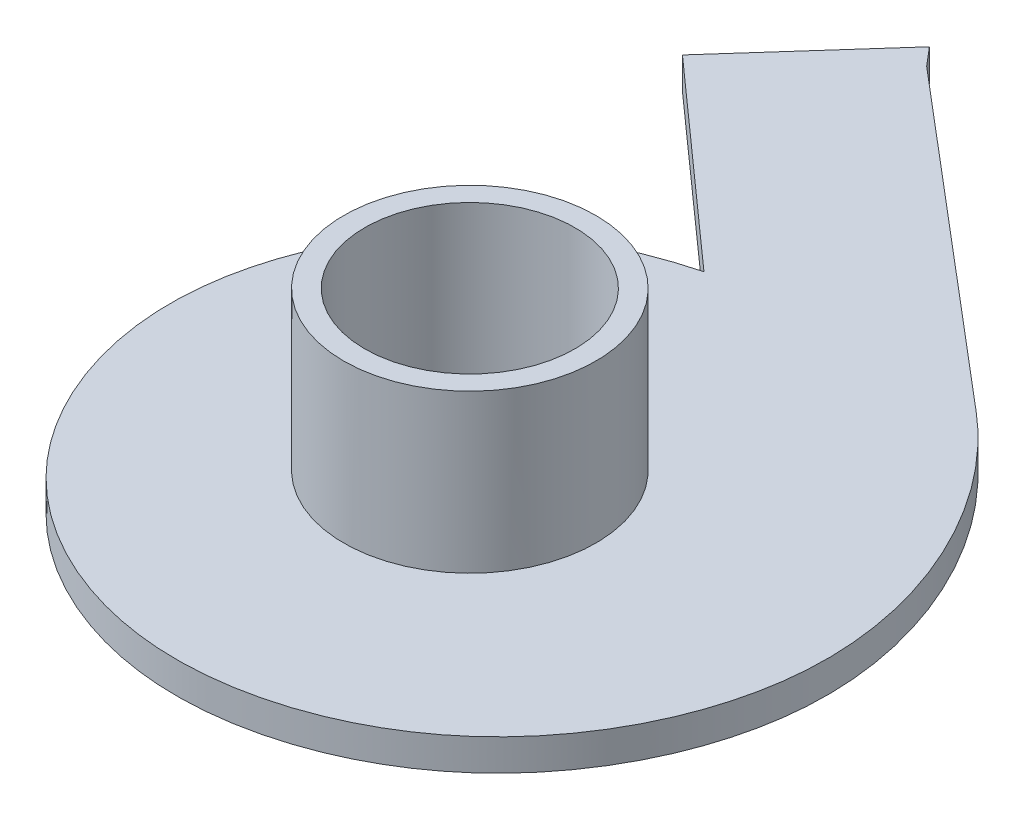
ISO-10303-21;
HEADER;
FILE_DESCRIPTION(('STEP AP214'),'2;1');
FILE_NAME('part.step','',(''),(''),'','','');
FILE_SCHEMA(('AUTOMOTIVE_DESIGN { 1 0 10303 214 1 1 1 1 }'));
ENDSEC;
DATA;
#1=APPLICATION_CONTEXT('core data for automotive mechanical design processes');
#2=APPLICATION_PROTOCOL_DEFINITION('international standard','automotive_design',2000,#1);
#3=PRODUCT_CONTEXT('',#1,'mechanical');
#4=PRODUCT('Part','Part','',(#3));
#5=PRODUCT_RELATED_PRODUCT_CATEGORY('part','',(#4));
#6=PRODUCT_DEFINITION_FORMATION('','',#4);
#7=PRODUCT_DEFINITION_CONTEXT('part definition',#1,'design');
#8=PRODUCT_DEFINITION('design','',#6,#7);
#9=PRODUCT_DEFINITION_SHAPE('','',#8);
#10=(LENGTH_UNIT() NAMED_UNIT(*) SI_UNIT(.MILLI.,.METRE.));
#11=(NAMED_UNIT(*) PLANE_ANGLE_UNIT() SI_UNIT($,.RADIAN.));
#12=(NAMED_UNIT(*) SI_UNIT($,.STERADIAN.) SOLID_ANGLE_UNIT());
#13=UNCERTAINTY_MEASURE_WITH_UNIT(LENGTH_MEASURE(1.E-05),#10,'distance_accuracy_value','');
#14=(GEOMETRIC_REPRESENTATION_CONTEXT(3) GLOBAL_UNCERTAINTY_ASSIGNED_CONTEXT((#13)) GLOBAL_UNIT_ASSIGNED_CONTEXT((#10,
#11,#12)) REPRESENTATION_CONTEXT('',''));
#15=CARTESIAN_POINT('',(0.,0.,0.));
#16=DIRECTION('',(0.,0.,1.));
#17=DIRECTION('',(1.,0.,0.));
#18=AXIS2_PLACEMENT_3D('',#15,#16,#17);
#19=CARTESIAN_POINT('',(-0.894449402051996,-8.5,29.4356862613004));
#20=DIRECTION('',(0.,-1.,0.));
#21=DIRECTION('',(0.,0.,-1.));
#22=AXIS2_PLACEMENT_3D('',#19,#20,#21);
#23=PLANE('',#22);
#24=CARTESIAN_POINT('',(-5.22427761905528,-8.5,-27.5));
#25=CARTESIAN_POINT('',(-10.5414760287274,-8.5,-26.1055486308366));
#26=CARTESIAN_POINT('',(-22.3528806270504,-8.5,-20.1536533849309));
#27=CARTESIAN_POINT('',(-31.0291674597841,-8.5,0.0898415924964994));
#28=CARTESIAN_POINT('',(-22.1814636965212,-8.5,22.3687512330108));
#29=CARTESIAN_POINT('',(0.169332427189046,-8.5,32.6204579671601));
#30=CARTESIAN_POINT('',(24.4327872859851,-8.5,24.2214208486498));
#31=CARTESIAN_POINT('',(36.1959543019705,-8.5,-0.308919094755898));
#32=CARTESIAN_POINT('',(28.5933574618061,-8.5,-19.700328424709));
#33=CARTESIAN_POINT('',(20.9709982748284,-8.5,-27.4655959659634));
#34=CARTESIAN_POINT('',(19.2682331922488,-8.5,-28.9079718519294));
#35=B_SPLINE_CURVE_WITH_KNOTS('',3,(#24,#25,#26,#27,#28,#29,#30,#31,#32,#33,#34),.UNSPECIFIED.,
.F.,.F.,(4,1,1,1,1,1,1,1,4),(0.0311414600631431,0.128255490419593,0.2545037351108,
0.382472085092047,0.513921580292955,0.651163570803289,0.795187225893968,0.945993586583319,
0.986328935233771),.UNSPECIFIED.);
#36=CARTESIAN_POINT('',(-5.22427761905528,-8.5,-27.5));
#37=VERTEX_POINT('',#36);
#38=CARTESIAN_POINT('',(19.2682331922488,-8.5,-28.9079718519294));
#39=VERTEX_POINT('',#38);
#40=EDGE_CURVE('E110',#37,#39,#35,.T.);
#41=ORIENTED_EDGE('',*,*,#40,.T.);
#42=DIRECTION('',(-0.763038224476822,0.,-0.646353361550212));
#43=VECTOR('',#42,1.);
#44=CARTESIAN_POINT('',(19.2682331922488,-8.5,-28.9079718519294));
#45=LINE('',#44,#43);
#46=CARTESIAN_POINT('',(-11.5525057401742,-8.5,-55.0155606664897));
#47=VERTEX_POINT('',#46);
#48=EDGE_CURVE('E128',#39,#47,#45,.T.);
#49=ORIENTED_EDGE('',*,*,#48,.T.);
#50=DIRECTION('',(-0.648121634012593,0.,-0.761536832677741));
#51=VECTOR('',#50,1.);
#52=CARTESIAN_POINT('',(-13.0354646093329,-8.5,-56.758023409507));
#53=LINE('',#52,#51);
#54=CARTESIAN_POINT('',(-13.0354646093329,-8.5,-56.758023409507));
#55=VERTEX_POINT('',#54);
#56=EDGE_CURVE('E135',#47,#55,#53,.T.);
#57=ORIENTED_EDGE('',*,*,#56,.T.);
#58=DIRECTION('',(-0.665460377003037,0.,0.746433176271645));
#59=VECTOR('',#58,1.);
#60=CARTESIAN_POINT('',(-24.1094731973058,-8.5,-44.3365364359222));
#61=LINE('',#60,#59);
#62=CARTESIAN_POINT('',(-24.1094731973058,-8.5,-44.3365364359222));
#63=VERTEX_POINT('',#62);
#64=EDGE_CURVE('E112',#55,#63,#61,.T.);
#65=ORIENTED_EDGE('',*,*,#64,.T.);
#66=DIRECTION('',(0.746433176271645,0.,0.665460377003037));
#67=VECTOR('',#66,1.);
#68=CARTESIAN_POINT('',(-5.22427761905528,-8.5,-27.5));
#69=LINE('',#68,#67);
#70=EDGE_CURVE('E98',#63,#37,#69,.T.);
#71=ORIENTED_EDGE('',*,*,#70,.T.);
#72=EDGE_LOOP('',(#41,#49,#57,#65,#71));
#73=FACE_BOUND('',#72,.T.);
#74=CARTESIAN_POINT('',(0.,-8.5,0.));
#75=DIRECTION('',(0.,-1.,0.));
#76=DIRECTION('',(0.,0.,-1.));
#77=AXIS2_PLACEMENT_3D('',#74,#75,#76);
#78=CIRCLE('',#77,12.);
#79=CARTESIAN_POINT('',(0.,-8.5,-12.));
#80=VERTEX_POINT('',#79);
#81=EDGE_CURVE('E11',#80,#80,#78,.F.);
#82=ORIENTED_EDGE('',*,*,#81,.F.);
#83=EDGE_LOOP('',(#82));
#84=FACE_BOUND('',#83,.T.);
#85=ADVANCED_FACE('F47',(#73,#84),#23,.F.);
#86=CARTESIAN_POINT('',(-24.1094731973058,-8.5,-44.3365364359222));
#87=DIRECTION('',(0.746433176271645,0.,0.665460377003037));
#88=DIRECTION('',(-0.665460377003037,0.,0.746433176271645));
#89=AXIS2_PLACEMENT_3D('',#86,#87,#88);
#90=PLANE('',#89);
#91=DIRECTION('',(0.,-1.,0.));
#92=VECTOR('',#91,1.);
#93=CARTESIAN_POINT('',(-24.1094731973058,-8.5,-44.3365364359222));
#94=LINE('',#93,#92);
#95=CARTESIAN_POINT('',(-24.1094731973058,-11.5,-44.3365364359222));
#96=VERTEX_POINT('',#95);
#97=EDGE_CURVE('E57',#63,#96,#94,.T.);
#98=ORIENTED_EDGE('',*,*,#97,.F.);
#99=ORIENTED_EDGE('',*,*,#64,.F.);
#100=DIRECTION('',(0.,-1.,0.));
#101=VECTOR('',#100,1.);
#102=CARTESIAN_POINT('',(-13.0354646093329,-8.5,-56.758023409507));
#103=LINE('',#102,#101);
#104=CARTESIAN_POINT('',(-13.0354646093329,-11.5,-56.758023409507));
#105=VERTEX_POINT('',#104);
#106=EDGE_CURVE('E230',#55,#105,#103,.T.);
#107=ORIENTED_EDGE('',*,*,#106,.T.);
#108=DIRECTION('',(-0.665460377003037,0.,0.746433176271645));
#109=VECTOR('',#108,1.);
#110=CARTESIAN_POINT('',(-24.1094731973058,-11.5,-44.3365364359222));
#111=LINE('',#110,#109);
#112=EDGE_CURVE('E216',#105,#96,#111,.T.);
#113=ORIENTED_EDGE('',*,*,#112,.T.);
#114=EDGE_LOOP('',(#98,#99,#107,#113));
#115=FACE_BOUND('',#114,.T.);
#116=ADVANCED_FACE('F158',(#115),#90,.F.);
#117=CARTESIAN_POINT('',(-13.0354646093329,-8.5,-56.758023409507));
#118=DIRECTION('',(-0.761536832677741,0.,0.648121634012593));
#119=DIRECTION('',(-0.648121634012593,0.,-0.761536832677741));
#120=AXIS2_PLACEMENT_3D('',#117,#118,#119);
#121=PLANE('',#120);
#122=ORIENTED_EDGE('',*,*,#106,.F.);
#123=ORIENTED_EDGE('',*,*,#56,.F.);
#124=DIRECTION('',(0.,-1.,0.));
#125=VECTOR('',#124,1.);
#126=CARTESIAN_POINT('',(-11.5525057401742,-8.5,-55.0155606664897));
#127=LINE('',#126,#125);
#128=CARTESIAN_POINT('',(-11.5525057401742,-11.5,-55.0155606664897));
#129=VERTEX_POINT('',#128);
#130=EDGE_CURVE('E232',#47,#129,#127,.T.);
#131=ORIENTED_EDGE('',*,*,#130,.T.);
#132=DIRECTION('',(-0.648121634012593,0.,-0.761536832677741));
#133=VECTOR('',#132,1.);
#134=CARTESIAN_POINT('',(-13.0354646093329,-11.5,-56.758023409507));
#135=LINE('',#134,#133);
#136=EDGE_CURVE('E226',#129,#105,#135,.T.);
#137=ORIENTED_EDGE('',*,*,#136,.T.);
#138=EDGE_LOOP('',(#122,#123,#131,#137));
#139=FACE_BOUND('',#138,.T.);
#140=ADVANCED_FACE('F156',(#139),#121,.F.);
#141=CARTESIAN_POINT('',(19.2682331922488,-8.5,-28.9079718519294));
#142=DIRECTION('',(-0.646353361550212,0.,0.763038224476822));
#143=DIRECTION('',(-0.763038224476822,0.,-0.646353361550212));
#144=AXIS2_PLACEMENT_3D('',#141,#142,#143);
#145=PLANE('',#144);
#146=ORIENTED_EDGE('',*,*,#130,.F.);
#147=ORIENTED_EDGE('',*,*,#48,.F.);
#148=DIRECTION('',(0.,-1.,0.));
#149=VECTOR('',#148,1.);
#150=CARTESIAN_POINT('',(19.2682331922488,-8.5,-28.9079718519294));
#151=LINE('',#150,#149);
#152=CARTESIAN_POINT('',(19.2682331922488,-11.5,-28.9079718519294));
#153=VERTEX_POINT('',#152);
#154=EDGE_CURVE('E65',#39,#153,#151,.T.);
#155=ORIENTED_EDGE('',*,*,#154,.T.);
#156=DIRECTION('',(-0.763038224476822,0.,-0.646353361550212));
#157=VECTOR('',#156,1.);
#158=CARTESIAN_POINT('',(19.2682331922488,-11.5,-28.9079718519294));
#159=LINE('',#158,#157);
#160=EDGE_CURVE('E105',#153,#129,#159,.T.);
#161=ORIENTED_EDGE('',*,*,#160,.T.);
#162=EDGE_LOOP('',(#146,#147,#155,#161));
#163=FACE_BOUND('',#162,.T.);
#164=ADVANCED_FACE('F152',(#163),#145,.F.);
#165=CARTESIAN_POINT('',(-5.22427761905528,-8.5,-27.5));
#166=CARTESIAN_POINT('',(-10.5414760287274,-8.5,-26.1055486308366));
#167=CARTESIAN_POINT('',(-22.3528806270504,-8.5,-20.1536533849309));
#168=CARTESIAN_POINT('',(-31.0291674597841,-8.5,0.0898415924964994));
#169=CARTESIAN_POINT('',(-22.1814636965212,-8.5,22.3687512330108));
#170=CARTESIAN_POINT('',(0.169332427189046,-8.5,32.6204579671601));
#171=CARTESIAN_POINT('',(24.4327872859851,-8.5,24.2214208486498));
#172=CARTESIAN_POINT('',(36.1959543019705,-8.5,-0.308919094755898));
#173=CARTESIAN_POINT('',(28.5933574618061,-8.5,-19.700328424709));
#174=CARTESIAN_POINT('',(20.9709982748284,-8.5,-27.4655959659634));
#175=CARTESIAN_POINT('',(19.2682331922488,-8.5,-28.9079718519294));
#176=B_SPLINE_CURVE_WITH_KNOTS('',3,(#165,#166,#167,#168,#169,#170,#171,#172,#173,#174,#175),
.UNSPECIFIED.,.F.,.F.,(4,1,1,1,1,1,1,1,4),(0.0311414600631431,0.128255490419593,0.2545037351108,
0.382472085092047,0.513921580292955,0.651163570803289,0.795187225893968,0.945993586583319,
0.986328935233771),.UNSPECIFIED.);
#177=DIRECTION('',(0.,-1.,0.));
#178=VECTOR('',#177,1.);
#179=SURFACE_OF_LINEAR_EXTRUSION('',#176,#178);
#180=ORIENTED_EDGE('',*,*,#154,.F.);
#181=ORIENTED_EDGE('',*,*,#40,.F.);
#182=DIRECTION('',(0.,-1.,0.));
#183=VECTOR('',#182,1.);
#184=CARTESIAN_POINT('',(-5.22427761905528,-8.5,-27.5));
#185=LINE('',#184,#183);
#186=CARTESIAN_POINT('',(-5.22427761905528,-11.5,-27.5));
#187=VERTEX_POINT('',#186);
#188=EDGE_CURVE('E96',#37,#187,#185,.T.);
#189=ORIENTED_EDGE('',*,*,#188,.T.);
#190=CARTESIAN_POINT('',(-5.22427761905528,-11.5,-27.5));
#191=CARTESIAN_POINT('',(-10.5414760287274,-11.5,-26.1055486308366));
#192=CARTESIAN_POINT('',(-22.3528806270504,-11.5,-20.1536533849309));
#193=CARTESIAN_POINT('',(-31.0291674597841,-11.5,0.0898415924964994));
#194=CARTESIAN_POINT('',(-22.1814636965212,-11.5,22.3687512330108));
#195=CARTESIAN_POINT('',(0.169332427189046,-11.5,32.6204579671601));
#196=CARTESIAN_POINT('',(24.4327872859851,-11.5,24.2214208486498));
#197=CARTESIAN_POINT('',(36.1959543019705,-11.5,-0.308919094755898));
#198=CARTESIAN_POINT('',(28.5933574618061,-11.5,-19.700328424709));
#199=CARTESIAN_POINT('',(20.9709982748284,-11.5,-27.4655959659634));
#200=CARTESIAN_POINT('',(19.2682331922488,-11.5,-28.9079718519294));
#201=B_SPLINE_CURVE_WITH_KNOTS('',3,(#190,#191,#192,#193,#194,#195,#196,#197,#198,#199,#200),
.UNSPECIFIED.,.F.,.F.,(4,1,1,1,1,1,1,1,4),(0.0311414600631431,0.128255490419593,0.2545037351108,
0.382472085092047,0.513921580292955,0.651163570803289,0.795187225893968,0.945993586583319,
0.986328935233771),.UNSPECIFIED.);
#202=EDGE_CURVE('E134',#187,#153,#201,.T.);
#203=ORIENTED_EDGE('',*,*,#202,.T.);
#204=EDGE_LOOP('',(#180,#181,#189,#203));
#205=FACE_BOUND('',#204,.T.);
#206=ADVANCED_FACE('F115',(#205),#179,.F.);
#207=CARTESIAN_POINT('',(-5.22427761905528,-8.5,-27.5));
#208=DIRECTION('',(0.665460377003037,0.,-0.746433176271645));
#209=DIRECTION('',(0.746433176271645,0.,0.665460377003037));
#210=AXIS2_PLACEMENT_3D('',#207,#208,#209);
#211=PLANE('',#210);
#212=ORIENTED_EDGE('',*,*,#70,.F.);
#213=ORIENTED_EDGE('',*,*,#97,.T.);
#214=DIRECTION('',(0.746433176271645,0.,0.665460377003037));
#215=VECTOR('',#214,1.);
#216=CARTESIAN_POINT('',(-5.22427761905528,-11.5,-27.5));
#217=LINE('',#216,#215);
#218=EDGE_CURVE('E100',#96,#187,#217,.T.);
#219=ORIENTED_EDGE('',*,*,#218,.T.);
#220=ORIENTED_EDGE('',*,*,#188,.F.);
#221=EDGE_LOOP('',(#212,#213,#219,#220));
#222=FACE_BOUND('',#221,.T.);
#223=ADVANCED_FACE('F49',(#222),#211,.F.);
#224=CARTESIAN_POINT('',(-0.894449402051996,-11.5,29.4356862613004));
#225=DIRECTION('',(0.,-1.,0.));
#226=DIRECTION('',(0.,0.,-1.));
#227=AXIS2_PLACEMENT_3D('',#224,#225,#226);
#228=PLANE('',#227);
#229=CARTESIAN_POINT('',(0.,-11.5,0.));
#230=DIRECTION('',(0.,1.,0.));
#231=DIRECTION('',(0.,0.,1.));
#232=AXIS2_PLACEMENT_3D('',#229,#230,#231);
#233=CIRCLE('',#232,10.);
#234=CARTESIAN_POINT('',(0.,-11.5,10.));
#235=VERTEX_POINT('',#234);
#236=EDGE_CURVE('E117',#235,#235,#233,.T.);
#237=ORIENTED_EDGE('',*,*,#236,.T.);
#238=EDGE_LOOP('',(#237));
#239=FACE_BOUND('',#238,.T.);
#240=ORIENTED_EDGE('',*,*,#202,.F.);
#241=ORIENTED_EDGE('',*,*,#218,.F.);
#242=ORIENTED_EDGE('',*,*,#112,.F.);
#243=ORIENTED_EDGE('',*,*,#136,.F.);
#244=ORIENTED_EDGE('',*,*,#160,.F.);
#245=EDGE_LOOP('',(#240,#241,#242,#243,#244));
#246=FACE_BOUND('',#245,.T.);
#247=ADVANCED_FACE('F173',(#239,#246),#228,.T.);
#248=CARTESIAN_POINT('',(0.,-11.5,0.));
#249=DIRECTION('',(0.,1.,0.));
#250=DIRECTION('',(0.,0.,1.));
#251=AXIS2_PLACEMENT_3D('',#248,#249,#250);
#252=CYLINDRICAL_SURFACE('',#251,10.);
#253=ORIENTED_EDGE('',*,*,#236,.F.);
#254=EDGE_LOOP('',(#253));
#255=FACE_BOUND('',#254,.T.);
#256=CARTESIAN_POINT('',(0.,6.5,0.));
#257=DIRECTION('',(0.,1.,0.));
#258=DIRECTION('',(0.,0.,1.));
#259=AXIS2_PLACEMENT_3D('',#256,#257,#258);
#260=CIRCLE('',#259,10.);
#261=CARTESIAN_POINT('',(0.,6.5,10.));
#262=VERTEX_POINT('',#261);
#263=EDGE_CURVE('E242',#262,#262,#260,.T.);
#264=ORIENTED_EDGE('',*,*,#263,.T.);
#265=EDGE_LOOP('',(#264));
#266=FACE_BOUND('',#265,.T.);
#267=ADVANCED_FACE('F177',(#255,#266),#252,.F.);
#268=CARTESIAN_POINT('',(0.,6.5,0.));
#269=DIRECTION('',(0.,1.,0.));
#270=DIRECTION('',(0.,0.,1.));
#271=AXIS2_PLACEMENT_3D('',#268,#269,#270);
#272=PLANE('',#271);
#273=CARTESIAN_POINT('',(0.,6.5,0.));
#274=DIRECTION('',(0.,1.,0.));
#275=DIRECTION('',(0.,0.,1.));
#276=AXIS2_PLACEMENT_3D('',#273,#274,#275);
#277=CIRCLE('',#276,12.);
#278=CARTESIAN_POINT('',(0.,6.5,12.));
#279=VERTEX_POINT('',#278);
#280=EDGE_CURVE('E121',#279,#279,#277,.T.);
#281=ORIENTED_EDGE('',*,*,#280,.T.);
#282=EDGE_LOOP('',(#281));
#283=FACE_BOUND('',#282,.T.);
#284=ORIENTED_EDGE('',*,*,#263,.F.);
#285=EDGE_LOOP('',(#284));
#286=FACE_BOUND('',#285,.T.);
#287=ADVANCED_FACE('F181',(#283,#286),#272,.T.);
#288=CARTESIAN_POINT('',(0.,6.5,0.));
#289=DIRECTION('',(0.,-1.,0.));
#290=DIRECTION('',(0.,0.,-1.));
#291=AXIS2_PLACEMENT_3D('',#288,#289,#290);
#292=CYLINDRICAL_SURFACE('',#291,12.);
#293=ORIENTED_EDGE('',*,*,#280,.F.);
#294=EDGE_LOOP('',(#293));
#295=FACE_BOUND('',#294,.T.);
#296=ORIENTED_EDGE('',*,*,#81,.T.);
#297=EDGE_LOOP('',(#296));
#298=FACE_BOUND('',#297,.T.);
#299=ADVANCED_FACE('F190',(#295,#298),#292,.T.);
#300=CLOSED_SHELL('',(#85,#116,#140,#164,#206,#223,#247,#267,#287,#299));
#301=MANIFOLD_SOLID_BREP('B2',#300);
#302=ADVANCED_BREP_SHAPE_REPRESENTATION('',(#18,#301),#14);
#303=SHAPE_DEFINITION_REPRESENTATION(#9,#302);
ENDSEC;
END-ISO-10303-21;
